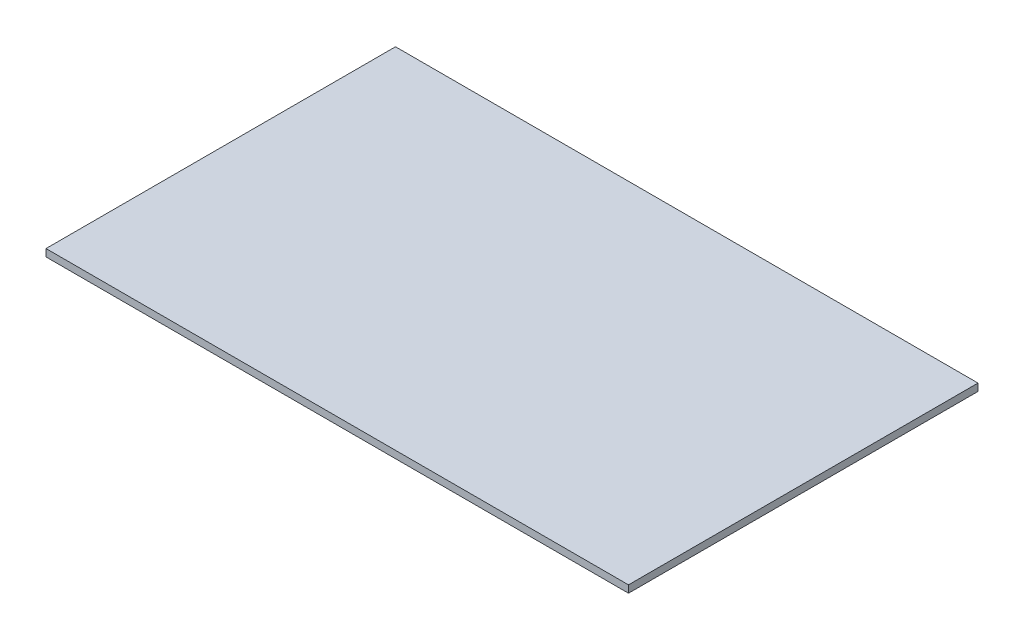
ISO-10303-21;
HEADER;
FILE_DESCRIPTION(('STEP AP214'),'2;1');
FILE_NAME('part.step','',(''),(''),'','','');
FILE_SCHEMA(('AUTOMOTIVE_DESIGN { 1 0 10303 214 1 1 1 1 }'));
ENDSEC;
DATA;
#1=APPLICATION_CONTEXT('core data for automotive mechanical design processes');
#2=APPLICATION_PROTOCOL_DEFINITION('international standard','automotive_design',2000,#1);
#3=PRODUCT_CONTEXT('',#1,'mechanical');
#4=PRODUCT('Part','Part','',(#3));
#5=PRODUCT_RELATED_PRODUCT_CATEGORY('part','',(#4));
#6=PRODUCT_DEFINITION_FORMATION('','',#4);
#7=PRODUCT_DEFINITION_CONTEXT('part definition',#1,'design');
#8=PRODUCT_DEFINITION('design','',#6,#7);
#9=PRODUCT_DEFINITION_SHAPE('','',#8);
#10=(LENGTH_UNIT() NAMED_UNIT(*) SI_UNIT(.MILLI.,.METRE.));
#11=(NAMED_UNIT(*) PLANE_ANGLE_UNIT() SI_UNIT($,.RADIAN.));
#12=(NAMED_UNIT(*) SI_UNIT($,.STERADIAN.) SOLID_ANGLE_UNIT());
#13=UNCERTAINTY_MEASURE_WITH_UNIT(LENGTH_MEASURE(1.E-05),#10,'distance_accuracy_value','');
#14=(GEOMETRIC_REPRESENTATION_CONTEXT(3) GLOBAL_UNCERTAINTY_ASSIGNED_CONTEXT((#13)) GLOBAL_UNIT_ASSIGNED_CONTEXT((#10,
#11,#12)) REPRESENTATION_CONTEXT('',''));
#15=CARTESIAN_POINT('',(0.,0.,0.));
#16=DIRECTION('',(0.,0.,1.));
#17=DIRECTION('',(1.,0.,0.));
#18=AXIS2_PLACEMENT_3D('',#15,#16,#17);
#19=CARTESIAN_POINT('',(-51.4864864864865,1.5875,-36.6126126126126));
#20=DIRECTION('',(0.,0.,-1.));
#21=DIRECTION('',(-1.,0.,0.));
#22=AXIS2_PLACEMENT_3D('',#19,#20,#21);
#23=PLANE('',#22);
#24=DIRECTION('',(1.,0.,0.));
#25=VECTOR('',#24,1.);
#26=CARTESIAN_POINT('',(-51.4864864864865,0.,-36.6126126126126));
#27=LINE('',#26,#25);
#28=CARTESIAN_POINT('',(-51.4864864864865,0.,-36.6126126126126));
#29=VERTEX_POINT('',#28);
#30=CARTESIAN_POINT('',(75.5135135135135,0.,-36.6126126126126));
#31=VERTEX_POINT('',#30);
#32=EDGE_CURVE('E100',#29,#31,#27,.T.);
#33=ORIENTED_EDGE('',*,*,#32,.F.);
#34=DIRECTION('',(0.,-1.,0.));
#35=VECTOR('',#34,1.);
#36=CARTESIAN_POINT('',(-51.4864864864865,1.5875,-36.6126126126126));
#37=LINE('',#36,#35);
#38=CARTESIAN_POINT('',(-51.4864864864865,1.5875,-36.6126126126126));
#39=VERTEX_POINT('',#38);
#40=EDGE_CURVE('E11',#39,#29,#37,.T.);
#41=ORIENTED_EDGE('',*,*,#40,.F.);
#42=DIRECTION('',(1.,0.,0.));
#43=VECTOR('',#42,1.);
#44=CARTESIAN_POINT('',(-51.4864864864865,1.5875,-36.6126126126126));
#45=LINE('',#44,#43);
#46=CARTESIAN_POINT('',(75.5135135135135,1.5875,-36.6126126126126));
#47=VERTEX_POINT('',#46);
#48=EDGE_CURVE('E95',#39,#47,#45,.T.);
#49=ORIENTED_EDGE('',*,*,#48,.T.);
#50=DIRECTION('',(0.,-1.,0.));
#51=VECTOR('',#50,1.);
#52=CARTESIAN_POINT('',(75.5135135135135,1.5875,-36.6126126126126));
#53=LINE('',#52,#51);
#54=EDGE_CURVE('E38',#47,#31,#53,.T.);
#55=ORIENTED_EDGE('',*,*,#54,.T.);
#56=EDGE_LOOP('',(#33,#41,#49,#55));
#57=FACE_BOUND('',#56,.T.);
#58=ADVANCED_FACE('F35',(#57),#23,.T.);
#59=CARTESIAN_POINT('',(-51.4864864864865,1.5875,-36.6126126126126));
#60=DIRECTION('',(1.,0.,0.));
#61=DIRECTION('',(0.,0.,-1.));
#62=AXIS2_PLACEMENT_3D('',#59,#60,#61);
#63=PLANE('',#62);
#64=DIRECTION('',(0.,0.,1.));
#65=VECTOR('',#64,1.);
#66=CARTESIAN_POINT('',(-51.4864864864865,0.,-36.6126126126126));
#67=LINE('',#66,#65);
#68=CARTESIAN_POINT('',(-51.4864864864865,0.,39.5873873873874));
#69=VERTEX_POINT('',#68);
#70=EDGE_CURVE('E68',#29,#69,#67,.T.);
#71=ORIENTED_EDGE('',*,*,#70,.T.);
#72=DIRECTION('',(0.,-1.,0.));
#73=VECTOR('',#72,1.);
#74=CARTESIAN_POINT('',(-51.4864864864865,1.5875,39.5873873873874));
#75=LINE('',#74,#73);
#76=CARTESIAN_POINT('',(-51.4864864864865,1.5875,39.5873873873874));
#77=VERTEX_POINT('',#76);
#78=EDGE_CURVE('E44',#77,#69,#75,.T.);
#79=ORIENTED_EDGE('',*,*,#78,.F.);
#80=DIRECTION('',(0.,0.,1.));
#81=VECTOR('',#80,1.);
#82=CARTESIAN_POINT('',(-51.4864864864865,1.5875,-36.6126126126126));
#83=LINE('',#82,#81);
#84=EDGE_CURVE('E85',#39,#77,#83,.T.);
#85=ORIENTED_EDGE('',*,*,#84,.F.);
#86=ORIENTED_EDGE('',*,*,#40,.T.);
#87=EDGE_LOOP('',(#71,#79,#85,#86));
#88=FACE_BOUND('',#87,.T.);
#89=ADVANCED_FACE('F110',(#88),#63,.F.);
#90=CARTESIAN_POINT('',(-51.4864864864865,1.5875,39.5873873873874));
#91=DIRECTION('',(0.,0.,-1.));
#92=DIRECTION('',(-1.,0.,0.));
#93=AXIS2_PLACEMENT_3D('',#90,#91,#92);
#94=PLANE('',#93);
#95=DIRECTION('',(1.,0.,0.));
#96=VECTOR('',#95,1.);
#97=CARTESIAN_POINT('',(-51.4864864864865,0.,39.5873873873874));
#98=LINE('',#97,#96);
#99=CARTESIAN_POINT('',(75.5135135135135,0.,39.5873873873874));
#100=VERTEX_POINT('',#99);
#101=EDGE_CURVE('E92',#69,#100,#98,.T.);
#102=ORIENTED_EDGE('',*,*,#101,.T.);
#103=DIRECTION('',(0.,-1.,0.));
#104=VECTOR('',#103,1.);
#105=CARTESIAN_POINT('',(75.5135135135135,1.5875,39.5873873873874));
#106=LINE('',#105,#104);
#107=CARTESIAN_POINT('',(75.5135135135135,1.5875,39.5873873873874));
#108=VERTEX_POINT('',#107);
#109=EDGE_CURVE('E89',#108,#100,#106,.T.);
#110=ORIENTED_EDGE('',*,*,#109,.F.);
#111=DIRECTION('',(1.,0.,0.));
#112=VECTOR('',#111,1.);
#113=CARTESIAN_POINT('',(-51.4864864864865,1.5875,39.5873873873874));
#114=LINE('',#113,#112);
#115=EDGE_CURVE('E80',#77,#108,#114,.T.);
#116=ORIENTED_EDGE('',*,*,#115,.F.);
#117=ORIENTED_EDGE('',*,*,#78,.T.);
#118=EDGE_LOOP('',(#102,#110,#116,#117));
#119=FACE_BOUND('',#118,.T.);
#120=ADVANCED_FACE('F90',(#119),#94,.F.);
#121=CARTESIAN_POINT('',(75.5135135135135,1.5875,-36.6126126126126));
#122=DIRECTION('',(1.,0.,0.));
#123=DIRECTION('',(0.,0.,-1.));
#124=AXIS2_PLACEMENT_3D('',#121,#122,#123);
#125=PLANE('',#124);
#126=DIRECTION('',(0.,0.,1.));
#127=VECTOR('',#126,1.);
#128=CARTESIAN_POINT('',(75.5135135135135,0.,-36.6126126126126));
#129=LINE('',#128,#127);
#130=EDGE_CURVE('E103',#31,#100,#129,.T.);
#131=ORIENTED_EDGE('',*,*,#130,.F.);
#132=ORIENTED_EDGE('',*,*,#54,.F.);
#133=DIRECTION('',(0.,0.,1.));
#134=VECTOR('',#133,1.);
#135=CARTESIAN_POINT('',(75.5135135135135,1.5875,-36.6126126126126));
#136=LINE('',#135,#134);
#137=EDGE_CURVE('E84',#47,#108,#136,.T.);
#138=ORIENTED_EDGE('',*,*,#137,.T.);
#139=ORIENTED_EDGE('',*,*,#109,.T.);
#140=EDGE_LOOP('',(#131,#132,#138,#139));
#141=FACE_BOUND('',#140,.T.);
#142=ADVANCED_FACE('F94',(#141),#125,.T.);
#143=CARTESIAN_POINT('',(0.,1.5875,0.));
#144=DIRECTION('',(0.,-1.,0.));
#145=DIRECTION('',(0.,0.,-1.));
#146=AXIS2_PLACEMENT_3D('',#143,#144,#145);
#147=PLANE('',#146);
#148=ORIENTED_EDGE('',*,*,#48,.F.);
#149=ORIENTED_EDGE('',*,*,#84,.T.);
#150=ORIENTED_EDGE('',*,*,#115,.T.);
#151=ORIENTED_EDGE('',*,*,#137,.F.);
#152=EDGE_LOOP('',(#148,#149,#150,#151));
#153=FACE_BOUND('',#152,.T.);
#154=ADVANCED_FACE('F83',(#153),#147,.F.);
#155=CARTESIAN_POINT('',(0.,0.,0.));
#156=DIRECTION('',(0.,-1.,0.));
#157=DIRECTION('',(0.,0.,-1.));
#158=AXIS2_PLACEMENT_3D('',#155,#156,#157);
#159=PLANE('',#158);
#160=ORIENTED_EDGE('',*,*,#32,.T.);
#161=ORIENTED_EDGE('',*,*,#130,.T.);
#162=ORIENTED_EDGE('',*,*,#101,.F.);
#163=ORIENTED_EDGE('',*,*,#70,.F.);
#164=EDGE_LOOP('',(#160,#161,#162,#163));
#165=FACE_BOUND('',#164,.T.);
#166=ADVANCED_FACE('F108',(#165),#159,.T.);
#167=CLOSED_SHELL('',(#58,#89,#120,#142,#154,#166));
#168=MANIFOLD_SOLID_BREP('B2',#167);
#169=ADVANCED_BREP_SHAPE_REPRESENTATION('',(#18,#168),#14);
#170=SHAPE_DEFINITION_REPRESENTATION(#9,#169);
ENDSEC;
END-ISO-10303-21;
